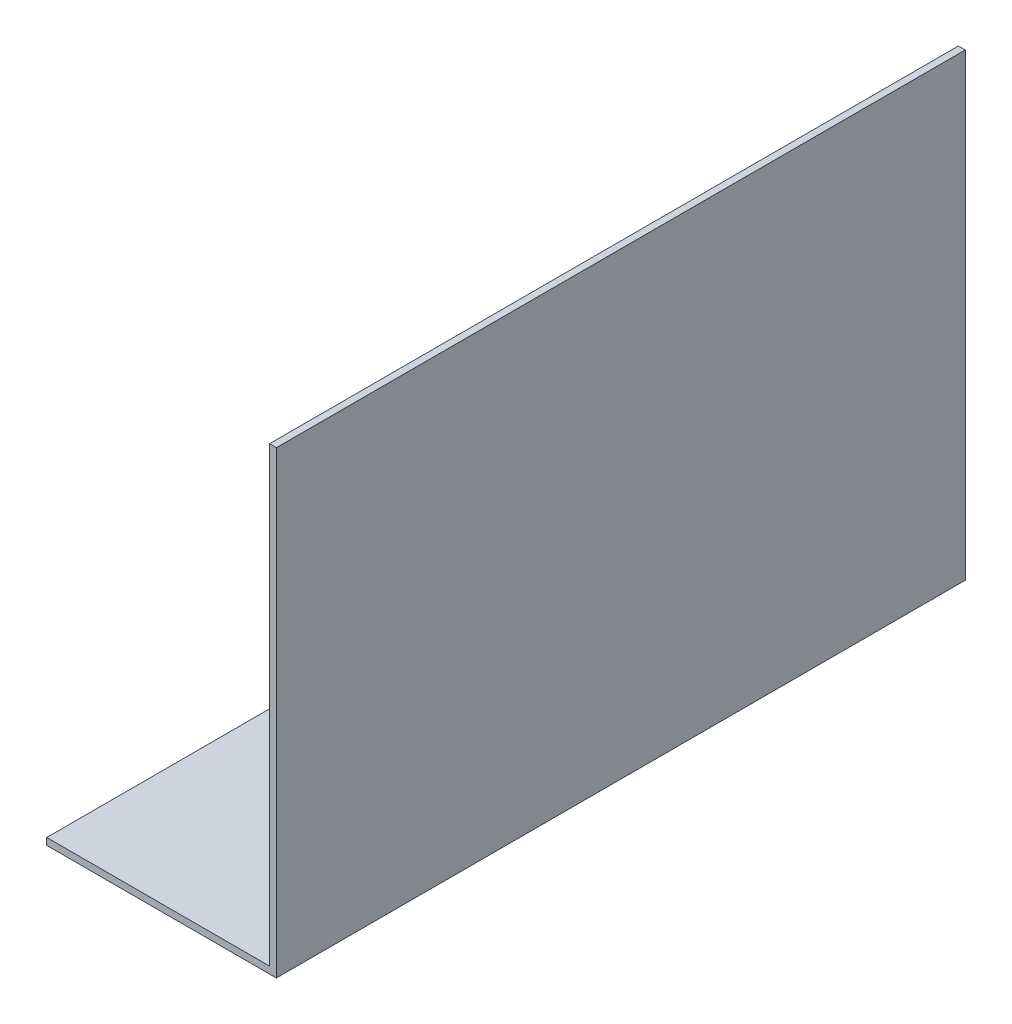
ISO-10303-21;
HEADER;
FILE_DESCRIPTION(('STEP AP214'),'2;1');
FILE_NAME('part.step','',(''),(''),'','','');
FILE_SCHEMA(('AUTOMOTIVE_DESIGN { 1 0 10303 214 1 1 1 1 }'));
ENDSEC;
DATA;
#1=APPLICATION_CONTEXT('core data for automotive mechanical design processes');
#2=APPLICATION_PROTOCOL_DEFINITION('international standard','automotive_design',2000,#1);
#3=PRODUCT_CONTEXT('',#1,'mechanical');
#4=PRODUCT('Part','Part','',(#3));
#5=PRODUCT_RELATED_PRODUCT_CATEGORY('part','',(#4));
#6=PRODUCT_DEFINITION_FORMATION('','',#4);
#7=PRODUCT_DEFINITION_CONTEXT('part definition',#1,'design');
#8=PRODUCT_DEFINITION('design','',#6,#7);
#9=PRODUCT_DEFINITION_SHAPE('','',#8);
#10=(LENGTH_UNIT() NAMED_UNIT(*) SI_UNIT(.MILLI.,.METRE.));
#11=(NAMED_UNIT(*) PLANE_ANGLE_UNIT() SI_UNIT($,.RADIAN.));
#12=(NAMED_UNIT(*) SI_UNIT($,.STERADIAN.) SOLID_ANGLE_UNIT());
#13=UNCERTAINTY_MEASURE_WITH_UNIT(LENGTH_MEASURE(1.E-05),#10,'distance_accuracy_value','');
#14=(GEOMETRIC_REPRESENTATION_CONTEXT(3) GLOBAL_UNCERTAINTY_ASSIGNED_CONTEXT((#13)) GLOBAL_UNIT_ASSIGNED_CONTEXT((#10,
#11,#12)) REPRESENTATION_CONTEXT('',''));
#15=CARTESIAN_POINT('',(0.,0.,0.));
#16=DIRECTION('',(0.,0.,1.));
#17=DIRECTION('',(1.,0.,0.));
#18=AXIS2_PLACEMENT_3D('',#15,#16,#17);
#19=CARTESIAN_POINT('',(0.,-1.5,150.));
#20=DIRECTION('',(1.,0.,0.));
#21=DIRECTION('',(0.,0.,-1.));
#22=AXIS2_PLACEMENT_3D('',#19,#20,#21);
#23=PLANE('',#22);
#24=DIRECTION('',(0.,-1.,0.));
#25=VECTOR('',#24,1.);
#26=CARTESIAN_POINT('',(0.,-1.5,0.));
#27=LINE('',#26,#25);
#28=CARTESIAN_POINT('',(0.,0.,0.));
#29=VERTEX_POINT('',#28);
#30=CARTESIAN_POINT('',(0.,-1.5,0.));
#31=VERTEX_POINT('',#30);
#32=EDGE_CURVE('E116',#29,#31,#27,.T.);
#33=ORIENTED_EDGE('',*,*,#32,.T.);
#34=DIRECTION('',(0.,0.,-1.));
#35=VECTOR('',#34,1.);
#36=CARTESIAN_POINT('',(0.,-1.5,150.));
#37=LINE('',#36,#35);
#38=CARTESIAN_POINT('',(0.,-1.5,150.));
#39=VERTEX_POINT('',#38);
#40=EDGE_CURVE('E11',#39,#31,#37,.T.);
#41=ORIENTED_EDGE('',*,*,#40,.F.);
#42=DIRECTION('',(0.,-1.,0.));
#43=VECTOR('',#42,1.);
#44=CARTESIAN_POINT('',(0.,-1.5,150.));
#45=LINE('',#44,#43);
#46=CARTESIAN_POINT('',(0.,0.,150.));
#47=VERTEX_POINT('',#46);
#48=EDGE_CURVE('E126',#47,#39,#45,.T.);
#49=ORIENTED_EDGE('',*,*,#48,.F.);
#50=DIRECTION('',(0.,0.,-1.));
#51=VECTOR('',#50,1.);
#52=CARTESIAN_POINT('',(0.,0.,150.));
#53=LINE('',#52,#51);
#54=EDGE_CURVE('E112',#47,#29,#53,.T.);
#55=ORIENTED_EDGE('',*,*,#54,.T.);
#56=EDGE_LOOP('',(#33,#41,#49,#55));
#57=FACE_BOUND('',#56,.T.);
#58=ADVANCED_FACE('F32',(#57),#23,.F.);
#59=CARTESIAN_POINT('',(50.,-1.49999999999999,150.));
#60=DIRECTION('',(0.,1.,0.));
#61=DIRECTION('',(-1.,0.,0.));
#62=AXIS2_PLACEMENT_3D('',#59,#60,#61);
#63=PLANE('',#62);
#64=DIRECTION('',(1.,0.,0.));
#65=VECTOR('',#64,1.);
#66=CARTESIAN_POINT('',(50.,-1.49999999999999,0.));
#67=LINE('',#66,#65);
#68=CARTESIAN_POINT('',(50.,-1.49999999999999,0.));
#69=VERTEX_POINT('',#68);
#70=EDGE_CURVE('E119',#31,#69,#67,.T.);
#71=ORIENTED_EDGE('',*,*,#70,.T.);
#72=DIRECTION('',(0.,0.,-1.));
#73=VECTOR('',#72,1.);
#74=CARTESIAN_POINT('',(50.,-1.49999999999999,150.));
#75=LINE('',#74,#73);
#76=CARTESIAN_POINT('',(50.,-1.49999999999999,150.));
#77=VERTEX_POINT('',#76);
#78=EDGE_CURVE('E40',#77,#69,#75,.T.);
#79=ORIENTED_EDGE('',*,*,#78,.F.);
#80=DIRECTION('',(1.,0.,0.));
#81=VECTOR('',#80,1.);
#82=CARTESIAN_POINT('',(50.,-1.49999999999999,150.));
#83=LINE('',#82,#81);
#84=EDGE_CURVE('E85',#39,#77,#83,.T.);
#85=ORIENTED_EDGE('',*,*,#84,.F.);
#86=ORIENTED_EDGE('',*,*,#40,.T.);
#87=EDGE_LOOP('',(#71,#79,#85,#86));
#88=FACE_BOUND('',#87,.T.);
#89=ADVANCED_FACE('F150',(#88),#63,.F.);
#90=CARTESIAN_POINT('',(50.,98.5,150.));
#91=DIRECTION('',(-1.,0.,0.));
#92=DIRECTION('',(0.,-1.,0.));
#93=AXIS2_PLACEMENT_3D('',#90,#91,#92);
#94=PLANE('',#93);
#95=DIRECTION('',(0.,1.,0.));
#96=VECTOR('',#95,1.);
#97=CARTESIAN_POINT('',(50.,98.5,0.));
#98=LINE('',#97,#96);
#99=CARTESIAN_POINT('',(50.,98.5,0.));
#100=VERTEX_POINT('',#99);
#101=EDGE_CURVE('E121',#69,#100,#98,.T.);
#102=ORIENTED_EDGE('',*,*,#101,.T.);
#103=DIRECTION('',(0.,0.,-1.));
#104=VECTOR('',#103,1.);
#105=CARTESIAN_POINT('',(50.,98.5,150.));
#106=LINE('',#105,#104);
#107=CARTESIAN_POINT('',(50.,98.5,150.));
#108=VERTEX_POINT('',#107);
#109=EDGE_CURVE('E107',#108,#100,#106,.T.);
#110=ORIENTED_EDGE('',*,*,#109,.F.);
#111=DIRECTION('',(0.,1.,0.));
#112=VECTOR('',#111,1.);
#113=CARTESIAN_POINT('',(50.,98.5,150.));
#114=LINE('',#113,#112);
#115=EDGE_CURVE('E98',#77,#108,#114,.T.);
#116=ORIENTED_EDGE('',*,*,#115,.F.);
#117=ORIENTED_EDGE('',*,*,#78,.T.);
#118=EDGE_LOOP('',(#102,#110,#116,#117));
#119=FACE_BOUND('',#118,.T.);
#120=ADVANCED_FACE('F132',(#119),#94,.F.);
#121=CARTESIAN_POINT('',(48.5,98.5,150.));
#122=DIRECTION('',(0.,-1.,0.));
#123=DIRECTION('',(0.,0.,-1.));
#124=AXIS2_PLACEMENT_3D('',#121,#122,#123);
#125=PLANE('',#124);
#126=DIRECTION('',(-1.,0.,0.));
#127=VECTOR('',#126,1.);
#128=CARTESIAN_POINT('',(48.5,98.5,0.));
#129=LINE('',#128,#127);
#130=CARTESIAN_POINT('',(48.5,98.5,0.));
#131=VERTEX_POINT('',#130);
#132=EDGE_CURVE('E106',#100,#131,#129,.T.);
#133=ORIENTED_EDGE('',*,*,#132,.T.);
#134=DIRECTION('',(0.,0.,-1.));
#135=VECTOR('',#134,1.);
#136=CARTESIAN_POINT('',(48.5,98.5,150.));
#137=LINE('',#136,#135);
#138=CARTESIAN_POINT('',(48.5,98.5,150.));
#139=VERTEX_POINT('',#138);
#140=EDGE_CURVE('E103',#139,#131,#137,.T.);
#141=ORIENTED_EDGE('',*,*,#140,.F.);
#142=DIRECTION('',(-1.,0.,0.));
#143=VECTOR('',#142,1.);
#144=CARTESIAN_POINT('',(48.5,98.5,150.));
#145=LINE('',#144,#143);
#146=EDGE_CURVE('E92',#108,#139,#145,.T.);
#147=ORIENTED_EDGE('',*,*,#146,.F.);
#148=ORIENTED_EDGE('',*,*,#109,.T.);
#149=EDGE_LOOP('',(#133,#141,#147,#148));
#150=FACE_BOUND('',#149,.T.);
#151=ADVANCED_FACE('F104',(#150),#125,.F.);
#152=CARTESIAN_POINT('',(48.5,0.,150.));
#153=DIRECTION('',(1.,0.,0.));
#154=DIRECTION('',(0.,0.,-1.));
#155=AXIS2_PLACEMENT_3D('',#152,#153,#154);
#156=PLANE('',#155);
#157=DIRECTION('',(0.,-1.,0.));
#158=VECTOR('',#157,1.);
#159=CARTESIAN_POINT('',(48.5,0.,0.));
#160=LINE('',#159,#158);
#161=CARTESIAN_POINT('',(48.5,0.,0.));
#162=VERTEX_POINT('',#161);
#163=EDGE_CURVE('E71',#131,#162,#160,.T.);
#164=ORIENTED_EDGE('',*,*,#163,.T.);
#165=DIRECTION('',(0.,0.,-1.));
#166=VECTOR('',#165,1.);
#167=CARTESIAN_POINT('',(48.5,0.,150.));
#168=LINE('',#167,#166);
#169=CARTESIAN_POINT('',(48.5,0.,150.));
#170=VERTEX_POINT('',#169);
#171=EDGE_CURVE('E108',#170,#162,#168,.T.);
#172=ORIENTED_EDGE('',*,*,#171,.F.);
#173=DIRECTION('',(0.,-1.,0.));
#174=VECTOR('',#173,1.);
#175=CARTESIAN_POINT('',(48.5,0.,150.));
#176=LINE('',#175,#174);
#177=EDGE_CURVE('E96',#139,#170,#176,.T.);
#178=ORIENTED_EDGE('',*,*,#177,.F.);
#179=ORIENTED_EDGE('',*,*,#140,.T.);
#180=EDGE_LOOP('',(#164,#172,#178,#179));
#181=FACE_BOUND('',#180,.T.);
#182=ADVANCED_FACE('F110',(#181),#156,.F.);
#183=CARTESIAN_POINT('',(0.,0.,150.));
#184=DIRECTION('',(0.,-1.,0.));
#185=DIRECTION('',(0.,0.,-1.));
#186=AXIS2_PLACEMENT_3D('',#183,#184,#185);
#187=PLANE('',#186);
#188=DIRECTION('',(-1.,0.,0.));
#189=VECTOR('',#188,1.);
#190=CARTESIAN_POINT('',(0.,0.,0.));
#191=LINE('',#190,#189);
#192=EDGE_CURVE('E77',#162,#29,#191,.T.);
#193=ORIENTED_EDGE('',*,*,#192,.T.);
#194=ORIENTED_EDGE('',*,*,#54,.F.);
#195=DIRECTION('',(-1.,0.,0.));
#196=VECTOR('',#195,1.);
#197=CARTESIAN_POINT('',(0.,0.,150.));
#198=LINE('',#197,#196);
#199=EDGE_CURVE('E48',#170,#47,#198,.T.);
#200=ORIENTED_EDGE('',*,*,#199,.F.);
#201=ORIENTED_EDGE('',*,*,#171,.T.);
#202=EDGE_LOOP('',(#193,#194,#200,#201));
#203=FACE_BOUND('',#202,.T.);
#204=ADVANCED_FACE('F139',(#203),#187,.F.);
#205=CARTESIAN_POINT('',(0.,0.,150.));
#206=DIRECTION('',(0.,0.,-1.));
#207=DIRECTION('',(-1.,0.,0.));
#208=AXIS2_PLACEMENT_3D('',#205,#206,#207);
#209=PLANE('',#208);
#210=ORIENTED_EDGE('',*,*,#48,.T.);
#211=ORIENTED_EDGE('',*,*,#84,.T.);
#212=ORIENTED_EDGE('',*,*,#115,.T.);
#213=ORIENTED_EDGE('',*,*,#146,.T.);
#214=ORIENTED_EDGE('',*,*,#177,.T.);
#215=ORIENTED_EDGE('',*,*,#199,.T.);
#216=EDGE_LOOP('',(#210,#211,#212,#213,#214,#215));
#217=FACE_BOUND('',#216,.T.);
#218=ADVANCED_FACE('F94',(#217),#209,.F.);
#219=CARTESIAN_POINT('',(0.,0.,0.));
#220=DIRECTION('',(0.,0.,-1.));
#221=DIRECTION('',(-1.,0.,0.));
#222=AXIS2_PLACEMENT_3D('',#219,#220,#221);
#223=PLANE('',#222);
#224=ORIENTED_EDGE('',*,*,#32,.F.);
#225=ORIENTED_EDGE('',*,*,#192,.F.);
#226=ORIENTED_EDGE('',*,*,#163,.F.);
#227=ORIENTED_EDGE('',*,*,#132,.F.);
#228=ORIENTED_EDGE('',*,*,#101,.F.);
#229=ORIENTED_EDGE('',*,*,#70,.F.);
#230=EDGE_LOOP('',(#224,#225,#226,#227,#228,#229));
#231=FACE_BOUND('',#230,.T.);
#232=ADVANCED_FACE('F135',(#231),#223,.T.);
#233=CLOSED_SHELL('',(#58,#89,#120,#151,#182,#204,#218,#232));
#234=MANIFOLD_SOLID_BREP('B2',#233);
#235=ADVANCED_BREP_SHAPE_REPRESENTATION('',(#18,#234),#14);
#236=SHAPE_DEFINITION_REPRESENTATION(#9,#235);
ENDSEC;
END-ISO-10303-21;
